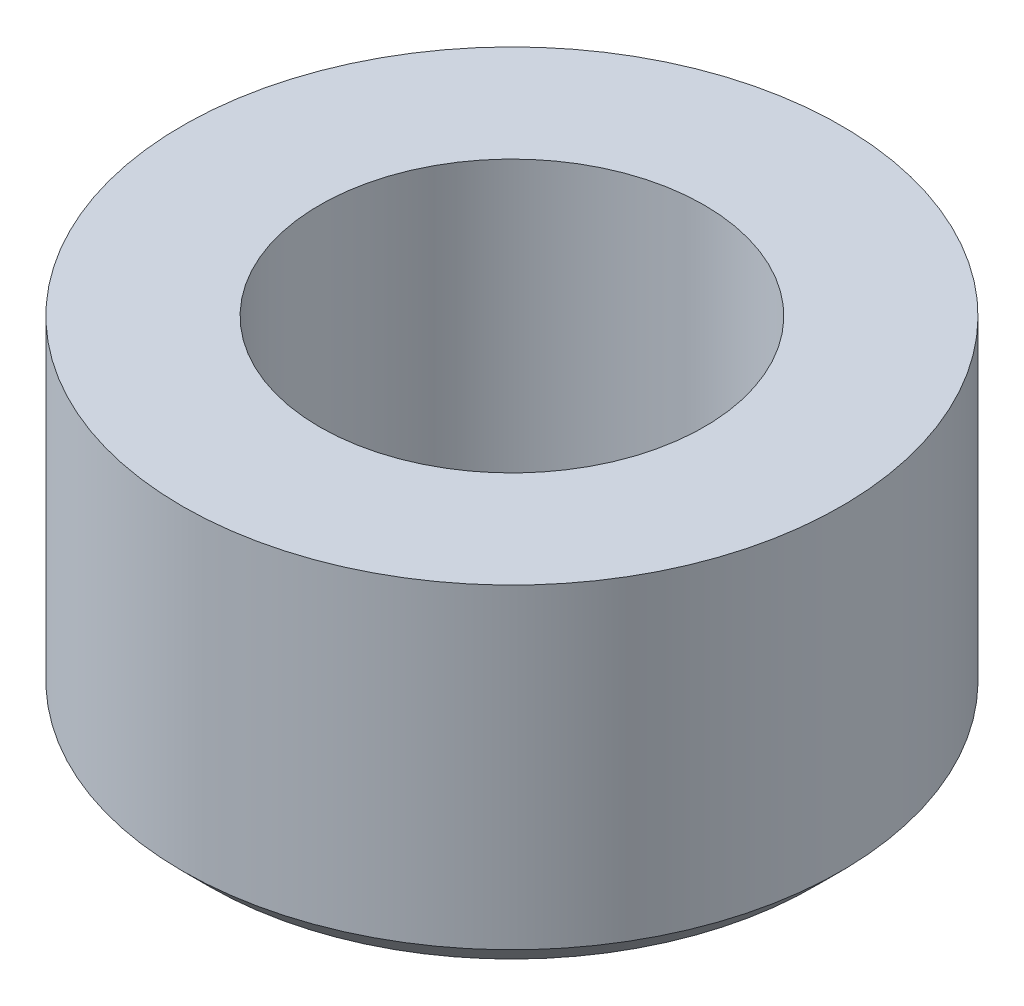
ISO-10303-21;
HEADER;
FILE_DESCRIPTION(('STEP AP214'),'2;1');
FILE_NAME('part.step','',(''),(''),'','','');
FILE_SCHEMA(('AUTOMOTIVE_DESIGN { 1 0 10303 214 1 1 1 1 }'));
ENDSEC;
DATA;
#1=APPLICATION_CONTEXT('core data for automotive mechanical design processes');
#2=APPLICATION_PROTOCOL_DEFINITION('international standard','automotive_design',2000,#1);
#3=PRODUCT_CONTEXT('',#1,'mechanical');
#4=PRODUCT('Part','Part','',(#3));
#5=PRODUCT_RELATED_PRODUCT_CATEGORY('part','',(#4));
#6=PRODUCT_DEFINITION_FORMATION('','',#4);
#7=PRODUCT_DEFINITION_CONTEXT('part definition',#1,'design');
#8=PRODUCT_DEFINITION('design','',#6,#7);
#9=PRODUCT_DEFINITION_SHAPE('','',#8);
#10=(LENGTH_UNIT() NAMED_UNIT(*) SI_UNIT(.MILLI.,.METRE.));
#11=(NAMED_UNIT(*) PLANE_ANGLE_UNIT() SI_UNIT($,.RADIAN.));
#12=(NAMED_UNIT(*) SI_UNIT($,.STERADIAN.) SOLID_ANGLE_UNIT());
#13=UNCERTAINTY_MEASURE_WITH_UNIT(LENGTH_MEASURE(1.E-05),#10,'distance_accuracy_value','');
#14=(GEOMETRIC_REPRESENTATION_CONTEXT(3) GLOBAL_UNCERTAINTY_ASSIGNED_CONTEXT((#13)) GLOBAL_UNIT_ASSIGNED_CONTEXT((#10,
#11,#12)) REPRESENTATION_CONTEXT('',''));
#15=CARTESIAN_POINT('',(0.,0.,0.));
#16=DIRECTION('',(0.,0.,1.));
#17=DIRECTION('',(1.,0.,0.));
#18=AXIS2_PLACEMENT_3D('',#15,#16,#17);
#19=CARTESIAN_POINT('',(0.,6.35,0.));
#20=DIRECTION('',(0.,1.,0.));
#21=DIRECTION('',(0.,0.,1.));
#22=AXIS2_PLACEMENT_3D('',#19,#20,#21);
#23=PLANE('',#22);
#24=CARTESIAN_POINT('',(0.,6.35,0.));
#25=DIRECTION('',(0.,1.,0.));
#26=DIRECTION('',(0.,0.,1.));
#27=AXIS2_PLACEMENT_3D('',#24,#25,#26);
#28=CIRCLE('',#27,6.096);
#29=CARTESIAN_POINT('',(0.,6.35,6.096));
#30=VERTEX_POINT('',#29);
#31=EDGE_CURVE('E53',#30,#30,#28,.T.);
#32=ORIENTED_EDGE('',*,*,#31,.T.);
#33=EDGE_LOOP('',(#32));
#34=FACE_BOUND('',#33,.T.);
#35=CARTESIAN_POINT('',(0.,6.35,0.));
#36=DIRECTION('',(0.,1.,0.));
#37=DIRECTION('',(0.,0.,1.));
#38=AXIS2_PLACEMENT_3D('',#35,#36,#37);
#39=CIRCLE('',#38,3.556);
#40=CARTESIAN_POINT('',(0.,6.35,3.556));
#41=VERTEX_POINT('',#40);
#42=EDGE_CURVE('E58',#41,#41,#39,.T.);
#43=ORIENTED_EDGE('',*,*,#42,.F.);
#44=EDGE_LOOP('',(#43));
#45=FACE_BOUND('',#44,.T.);
#46=ADVANCED_FACE('F39',(#34,#45),#23,.T.);
#47=CARTESIAN_POINT('',(0.,0.,0.));
#48=DIRECTION('',(0.,1.,0.));
#49=DIRECTION('',(0.,0.,1.));
#50=AXIS2_PLACEMENT_3D('',#47,#48,#49);
#51=PLANE('',#50);
#52=CARTESIAN_POINT('',(0.,0.,0.));
#53=DIRECTION('',(0.,1.,0.));
#54=DIRECTION('',(0.,0.,1.));
#55=AXIS2_PLACEMENT_3D('',#52,#53,#54);
#56=CIRCLE('',#55,5.588);
#57=CARTESIAN_POINT('',(0.,0.,5.588));
#58=VERTEX_POINT('',#57);
#59=EDGE_CURVE('E10',#58,#58,#56,.F.);
#60=ORIENTED_EDGE('',*,*,#59,.T.);
#61=EDGE_LOOP('',(#60));
#62=FACE_BOUND('',#61,.T.);
#63=CARTESIAN_POINT('',(0.,0.,0.));
#64=DIRECTION('',(0.,1.,0.));
#65=DIRECTION('',(0.,0.,1.));
#66=AXIS2_PLACEMENT_3D('',#63,#64,#65);
#67=CIRCLE('',#66,3.556);
#68=CARTESIAN_POINT('',(0.,0.,3.556));
#69=VERTEX_POINT('',#68);
#70=EDGE_CURVE('E61',#69,#69,#67,.T.);
#71=ORIENTED_EDGE('',*,*,#70,.T.);
#72=EDGE_LOOP('',(#71));
#73=FACE_BOUND('',#72,.T.);
#74=ADVANCED_FACE('F73',(#62,#73),#51,.F.);
#75=CARTESIAN_POINT('',(0.,6.35,0.));
#76=DIRECTION('',(0.,-1.,0.));
#77=DIRECTION('',(0.,0.,-1.));
#78=AXIS2_PLACEMENT_3D('',#75,#76,#77);
#79=CYLINDRICAL_SURFACE('',#78,6.096);
#80=CARTESIAN_POINT('',(0.,0.507999999999999,0.));
#81=DIRECTION('',(0.,1.,0.));
#82=DIRECTION('',(0.,0.,1.));
#83=AXIS2_PLACEMENT_3D('',#80,#81,#82);
#84=CIRCLE('',#83,6.096);
#85=CARTESIAN_POINT('',(0.,0.507999999999999,6.096));
#86=VERTEX_POINT('',#85);
#87=EDGE_CURVE('E48',#86,#86,#84,.T.);
#88=ORIENTED_EDGE('',*,*,#87,.T.);
#89=EDGE_LOOP('',(#88));
#90=FACE_BOUND('',#89,.T.);
#91=ORIENTED_EDGE('',*,*,#31,.F.);
#92=EDGE_LOOP('',(#91));
#93=FACE_BOUND('',#92,.T.);
#94=ADVANCED_FACE('F79',(#90,#93),#79,.T.);
#95=CARTESIAN_POINT('',(0.,6.35,0.));
#96=DIRECTION('',(0.,-1.,0.));
#97=DIRECTION('',(0.,0.,-1.));
#98=AXIS2_PLACEMENT_3D('',#95,#96,#97);
#99=CYLINDRICAL_SURFACE('',#98,3.556);
#100=ORIENTED_EDGE('',*,*,#42,.T.);
#101=EDGE_LOOP('',(#100));
#102=FACE_BOUND('',#101,.T.);
#103=ORIENTED_EDGE('',*,*,#70,.F.);
#104=EDGE_LOOP('',(#103));
#105=FACE_BOUND('',#104,.T.);
#106=ADVANCED_FACE('F69',(#102,#105),#99,.F.);
#107=CARTESIAN_POINT('',(0.,0.507999999999999,0.));
#108=DIRECTION('',(0.,1.,0.));
#109=DIRECTION('',(0.,0.,1.));
#110=AXIS2_PLACEMENT_3D('',#107,#108,#109);
#111=CONICAL_SURFACE('',#110,6.096,0.78539816339745);
#112=ORIENTED_EDGE('',*,*,#59,.F.);
#113=EDGE_LOOP('',(#112));
#114=FACE_BOUND('',#113,.T.);
#115=ORIENTED_EDGE('',*,*,#87,.F.);
#116=EDGE_LOOP('',(#115));
#117=FACE_BOUND('',#116,.T.);
#118=ADVANCED_FACE('F42',(#114,#117),#111,.T.);
#119=CLOSED_SHELL('',(#46,#74,#94,#106,#118));
#120=MANIFOLD_SOLID_BREP('B2',#119);
#121=ADVANCED_BREP_SHAPE_REPRESENTATION('',(#18,#120),#14);
#122=SHAPE_DEFINITION_REPRESENTATION(#9,#121);
ENDSEC;
END-ISO-10303-21;
